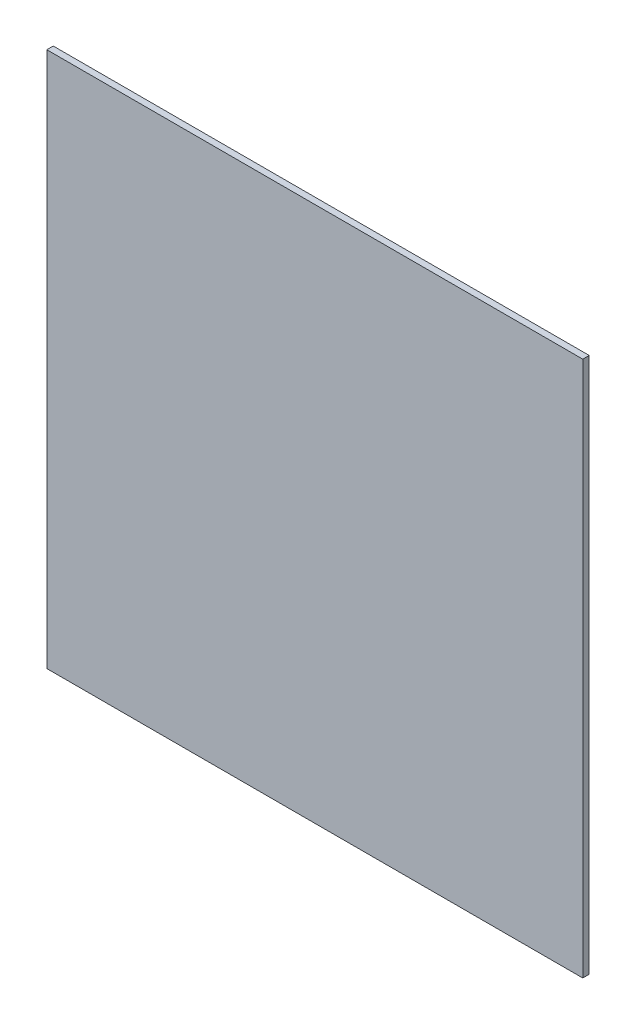
ISO-10303-21;
HEADER;
FILE_DESCRIPTION(('STEP AP214'),'2;1');
FILE_NAME('part.step','',(''),(''),'','','');
FILE_SCHEMA(('AUTOMOTIVE_DESIGN { 1 0 10303 214 1 1 1 1 }'));
ENDSEC;
DATA;
#1=APPLICATION_CONTEXT('core data for automotive mechanical design processes');
#2=APPLICATION_PROTOCOL_DEFINITION('international standard','automotive_design',2000,#1);
#3=PRODUCT_CONTEXT('',#1,'mechanical');
#4=PRODUCT('Part','Part','',(#3));
#5=PRODUCT_RELATED_PRODUCT_CATEGORY('part','',(#4));
#6=PRODUCT_DEFINITION_FORMATION('','',#4);
#7=PRODUCT_DEFINITION_CONTEXT('part definition',#1,'design');
#8=PRODUCT_DEFINITION('design','',#6,#7);
#9=PRODUCT_DEFINITION_SHAPE('','',#8);
#10=(LENGTH_UNIT() NAMED_UNIT(*) SI_UNIT(.MILLI.,.METRE.));
#11=(NAMED_UNIT(*) PLANE_ANGLE_UNIT() SI_UNIT($,.RADIAN.));
#12=(NAMED_UNIT(*) SI_UNIT($,.STERADIAN.) SOLID_ANGLE_UNIT());
#13=UNCERTAINTY_MEASURE_WITH_UNIT(LENGTH_MEASURE(1.E-05),#10,'distance_accuracy_value','');
#14=(GEOMETRIC_REPRESENTATION_CONTEXT(3) GLOBAL_UNCERTAINTY_ASSIGNED_CONTEXT((#13)) GLOBAL_UNIT_ASSIGNED_CONTEXT((#10,
#11,#12)) REPRESENTATION_CONTEXT('',''));
#15=CARTESIAN_POINT('',(0.,0.,0.));
#16=DIRECTION('',(0.,0.,1.));
#17=DIRECTION('',(1.,0.,0.));
#18=AXIS2_PLACEMENT_3D('',#15,#16,#17);
#19=CARTESIAN_POINT('',(150.,150.,3.6));
#20=DIRECTION('',(-1.,0.,0.));
#21=DIRECTION('',(0.,-1.,0.));
#22=AXIS2_PLACEMENT_3D('',#19,#20,#21);
#23=PLANE('',#22);
#24=DIRECTION('',(0.,1.,0.));
#25=VECTOR('',#24,1.);
#26=CARTESIAN_POINT('',(150.,150.,0.));
#27=LINE('',#26,#25);
#28=CARTESIAN_POINT('',(150.,-150.,0.));
#29=VERTEX_POINT('',#28);
#30=CARTESIAN_POINT('',(150.,150.,0.));
#31=VERTEX_POINT('',#30);
#32=EDGE_CURVE('E96',#29,#31,#27,.T.);
#33=ORIENTED_EDGE('',*,*,#32,.T.);
#34=DIRECTION('',(0.,0.,-1.));
#35=VECTOR('',#34,1.);
#36=CARTESIAN_POINT('',(150.,150.,3.6));
#37=LINE('',#36,#35);
#38=CARTESIAN_POINT('',(150.,150.,3.6));
#39=VERTEX_POINT('',#38);
#40=EDGE_CURVE('E11',#39,#31,#37,.T.);
#41=ORIENTED_EDGE('',*,*,#40,.F.);
#42=DIRECTION('',(0.,1.,0.));
#43=VECTOR('',#42,1.);
#44=CARTESIAN_POINT('',(150.,150.,3.6));
#45=LINE('',#44,#43);
#46=CARTESIAN_POINT('',(150.,-150.,3.6));
#47=VERTEX_POINT('',#46);
#48=EDGE_CURVE('E84',#47,#39,#45,.T.);
#49=ORIENTED_EDGE('',*,*,#48,.F.);
#50=DIRECTION('',(0.,0.,-1.));
#51=VECTOR('',#50,1.);
#52=CARTESIAN_POINT('',(150.,-150.,3.6));
#53=LINE('',#52,#51);
#54=EDGE_CURVE('E92',#47,#29,#53,.T.);
#55=ORIENTED_EDGE('',*,*,#54,.T.);
#56=EDGE_LOOP('',(#33,#41,#49,#55));
#57=FACE_BOUND('',#56,.T.);
#58=ADVANCED_FACE('F33',(#57),#23,.F.);
#59=CARTESIAN_POINT('',(-150.,150.,3.6));
#60=DIRECTION('',(0.,-1.,0.));
#61=DIRECTION('',(0.,0.,-1.));
#62=AXIS2_PLACEMENT_3D('',#59,#60,#61);
#63=PLANE('',#62);
#64=DIRECTION('',(-1.,0.,0.));
#65=VECTOR('',#64,1.);
#66=CARTESIAN_POINT('',(-150.,150.,0.));
#67=LINE('',#66,#65);
#68=CARTESIAN_POINT('',(-150.,150.,0.));
#69=VERTEX_POINT('',#68);
#70=EDGE_CURVE('E88',#31,#69,#67,.T.);
#71=ORIENTED_EDGE('',*,*,#70,.T.);
#72=DIRECTION('',(0.,0.,-1.));
#73=VECTOR('',#72,1.);
#74=CARTESIAN_POINT('',(-150.,150.,3.6));
#75=LINE('',#74,#73);
#76=CARTESIAN_POINT('',(-150.,150.,3.6));
#77=VERTEX_POINT('',#76);
#78=EDGE_CURVE('E41',#77,#69,#75,.T.);
#79=ORIENTED_EDGE('',*,*,#78,.F.);
#80=DIRECTION('',(-1.,0.,0.));
#81=VECTOR('',#80,1.);
#82=CARTESIAN_POINT('',(-150.,150.,3.6));
#83=LINE('',#82,#81);
#84=EDGE_CURVE('E79',#39,#77,#83,.T.);
#85=ORIENTED_EDGE('',*,*,#84,.F.);
#86=ORIENTED_EDGE('',*,*,#40,.T.);
#87=EDGE_LOOP('',(#71,#79,#85,#86));
#88=FACE_BOUND('',#87,.T.);
#89=ADVANCED_FACE('F87',(#88),#63,.F.);
#90=CARTESIAN_POINT('',(-150.,150.,3.6));
#91=DIRECTION('',(1.,0.,0.));
#92=DIRECTION('',(0.,1.,0.));
#93=AXIS2_PLACEMENT_3D('',#90,#91,#92);
#94=PLANE('',#93);
#95=DIRECTION('',(0.,-1.,0.));
#96=VECTOR('',#95,1.);
#97=CARTESIAN_POINT('',(-150.,150.,0.));
#98=LINE('',#97,#96);
#99=CARTESIAN_POINT('',(-150.,-150.,0.));
#100=VERTEX_POINT('',#99);
#101=EDGE_CURVE('E66',#69,#100,#98,.T.);
#102=ORIENTED_EDGE('',*,*,#101,.T.);
#103=DIRECTION('',(0.,0.,-1.));
#104=VECTOR('',#103,1.);
#105=CARTESIAN_POINT('',(-150.,-150.,3.6));
#106=LINE('',#105,#104);
#107=CARTESIAN_POINT('',(-150.,-150.,3.6));
#108=VERTEX_POINT('',#107);
#109=EDGE_CURVE('E89',#108,#100,#106,.T.);
#110=ORIENTED_EDGE('',*,*,#109,.F.);
#111=DIRECTION('',(0.,-1.,0.));
#112=VECTOR('',#111,1.);
#113=CARTESIAN_POINT('',(-150.,150.,3.6));
#114=LINE('',#113,#112);
#115=EDGE_CURVE('E82',#77,#108,#114,.T.);
#116=ORIENTED_EDGE('',*,*,#115,.F.);
#117=ORIENTED_EDGE('',*,*,#78,.T.);
#118=EDGE_LOOP('',(#102,#110,#116,#117));
#119=FACE_BOUND('',#118,.T.);
#120=ADVANCED_FACE('F90',(#119),#94,.F.);
#121=CARTESIAN_POINT('',(-150.,-150.,3.6));
#122=DIRECTION('',(0.,1.,0.));
#123=DIRECTION('',(0.,0.,1.));
#124=AXIS2_PLACEMENT_3D('',#121,#122,#123);
#125=PLANE('',#124);
#126=DIRECTION('',(1.,0.,0.));
#127=VECTOR('',#126,1.);
#128=CARTESIAN_POINT('',(-150.,-150.,0.));
#129=LINE('',#128,#127);
#130=EDGE_CURVE('E72',#100,#29,#129,.T.);
#131=ORIENTED_EDGE('',*,*,#130,.T.);
#132=ORIENTED_EDGE('',*,*,#54,.F.);
#133=DIRECTION('',(1.,0.,0.));
#134=VECTOR('',#133,1.);
#135=CARTESIAN_POINT('',(-150.,-150.,3.6));
#136=LINE('',#135,#134);
#137=EDGE_CURVE('E49',#108,#47,#136,.T.);
#138=ORIENTED_EDGE('',*,*,#137,.F.);
#139=ORIENTED_EDGE('',*,*,#109,.T.);
#140=EDGE_LOOP('',(#131,#132,#138,#139));
#141=FACE_BOUND('',#140,.T.);
#142=ADVANCED_FACE('F103',(#141),#125,.F.);
#143=CARTESIAN_POINT('',(0.,0.,3.6));
#144=DIRECTION('',(0.,0.,1.));
#145=DIRECTION('',(1.,0.,0.));
#146=AXIS2_PLACEMENT_3D('',#143,#144,#145);
#147=PLANE('',#146);
#148=ORIENTED_EDGE('',*,*,#48,.T.);
#149=ORIENTED_EDGE('',*,*,#84,.T.);
#150=ORIENTED_EDGE('',*,*,#115,.T.);
#151=ORIENTED_EDGE('',*,*,#137,.T.);
#152=EDGE_LOOP('',(#148,#149,#150,#151));
#153=FACE_BOUND('',#152,.T.);
#154=ADVANCED_FACE('F80',(#153),#147,.T.);
#155=CARTESIAN_POINT('',(0.,0.,0.));
#156=DIRECTION('',(0.,0.,1.));
#157=DIRECTION('',(1.,0.,0.));
#158=AXIS2_PLACEMENT_3D('',#155,#156,#157);
#159=PLANE('',#158);
#160=ORIENTED_EDGE('',*,*,#32,.F.);
#161=ORIENTED_EDGE('',*,*,#130,.F.);
#162=ORIENTED_EDGE('',*,*,#101,.F.);
#163=ORIENTED_EDGE('',*,*,#70,.F.);
#164=EDGE_LOOP('',(#160,#161,#162,#163));
#165=FACE_BOUND('',#164,.T.);
#166=ADVANCED_FACE('F106',(#165),#159,.F.);
#167=CLOSED_SHELL('',(#58,#89,#120,#142,#154,#166));
#168=MANIFOLD_SOLID_BREP('B2',#167);
#169=ADVANCED_BREP_SHAPE_REPRESENTATION('',(#18,#168),#14);
#170=SHAPE_DEFINITION_REPRESENTATION(#9,#169);
ENDSEC;
END-ISO-10303-21;
